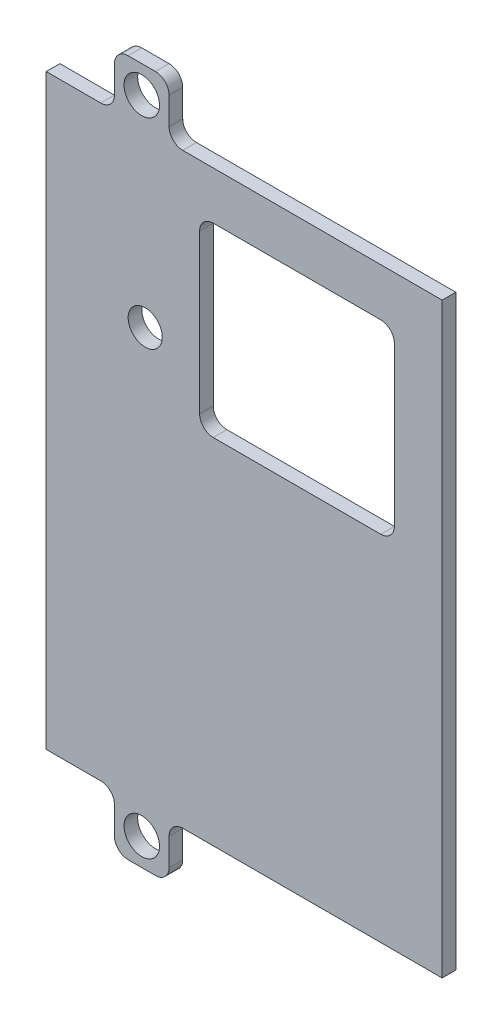
ISO-10303-21;
HEADER;
FILE_DESCRIPTION(('STEP AP214'),'2;1');
FILE_NAME('part.step','',(''),(''),'','','');
FILE_SCHEMA(('AUTOMOTIVE_DESIGN { 1 0 10303 214 1 1 1 1 }'));
ENDSEC;
DATA;
#1=APPLICATION_CONTEXT('core data for automotive mechanical design processes');
#2=APPLICATION_PROTOCOL_DEFINITION('international standard','automotive_design',2000,#1);
#3=PRODUCT_CONTEXT('',#1,'mechanical');
#4=PRODUCT('Part','Part','',(#3));
#5=PRODUCT_RELATED_PRODUCT_CATEGORY('part','',(#4));
#6=PRODUCT_DEFINITION_FORMATION('','',#4);
#7=PRODUCT_DEFINITION_CONTEXT('part definition',#1,'design');
#8=PRODUCT_DEFINITION('design','',#6,#7);
#9=PRODUCT_DEFINITION_SHAPE('','',#8);
#10=(LENGTH_UNIT() NAMED_UNIT(*) SI_UNIT(.MILLI.,.METRE.));
#11=(NAMED_UNIT(*) PLANE_ANGLE_UNIT() SI_UNIT($,.RADIAN.));
#12=(NAMED_UNIT(*) SI_UNIT($,.STERADIAN.) SOLID_ANGLE_UNIT());
#13=UNCERTAINTY_MEASURE_WITH_UNIT(LENGTH_MEASURE(1.E-05),#10,'distance_accuracy_value','');
#14=(GEOMETRIC_REPRESENTATION_CONTEXT(3) GLOBAL_UNCERTAINTY_ASSIGNED_CONTEXT((#13)) GLOBAL_UNIT_ASSIGNED_CONTEXT((#10,
#11,#12)) REPRESENTATION_CONTEXT('',''));
#15=CARTESIAN_POINT('',(0.,0.,0.));
#16=DIRECTION('',(0.,0.,1.));
#17=DIRECTION('',(1.,0.,0.));
#18=AXIS2_PLACEMENT_3D('',#15,#16,#17);
#19=CARTESIAN_POINT('',(0.,0.,0.));
#20=DIRECTION('',(0.,0.,1.));
#21=DIRECTION('',(1.,0.,0.));
#22=AXIS2_PLACEMENT_3D('',#19,#20,#21);
#23=PLANE('',#22);
#24=DIRECTION('',(1.,0.,0.));
#25=VECTOR('',#24,1.);
#26=CARTESIAN_POINT('',(0.,96.52,0.));
#27=LINE('',#26,#25);
#28=CARTESIAN_POINT('',(27.2681261110636,96.52,0.));
#29=VERTEX_POINT('',#28);
#30=CARTESIAN_POINT('',(58.42,96.52,0.));
#31=VERTEX_POINT('',#30);
#32=EDGE_CURVE('E428',#29,#31,#27,.T.);
#33=ORIENTED_EDGE('',*,*,#32,.F.);
#34=CARTESIAN_POINT('',(27.2681261110636,93.98,0.));
#35=DIRECTION('',(0.,0.,1.));
#36=DIRECTION('',(1.,0.,0.));
#37=AXIS2_PLACEMENT_3D('',#34,#35,#36);
#38=CIRCLE('',#37,2.54);
#39=CARTESIAN_POINT('',(24.7281261110636,93.98,0.));
#40=VERTEX_POINT('',#39);
#41=EDGE_CURVE('E503',#29,#40,#38,.T.);
#42=ORIENTED_EDGE('',*,*,#41,.T.);
#43=DIRECTION('',(0.,-1.,0.));
#44=VECTOR('',#43,1.);
#45=CARTESIAN_POINT('',(24.7281261110636,0.,0.));
#46=LINE('',#45,#44);
#47=CARTESIAN_POINT('',(24.7281261110636,64.5154372798244,0.));
#48=VERTEX_POINT('',#47);
#49=EDGE_CURVE('E425',#40,#48,#46,.T.);
#50=ORIENTED_EDGE('',*,*,#49,.T.);
#51=CARTESIAN_POINT('',(27.2681261110636,64.5154372798244,0.));
#52=DIRECTION('',(0.,0.,1.));
#53=DIRECTION('',(1.,0.,0.));
#54=AXIS2_PLACEMENT_3D('',#51,#52,#53);
#55=CIRCLE('',#54,2.54);
#56=CARTESIAN_POINT('',(27.2681261110636,61.9754372798244,0.));
#57=VERTEX_POINT('',#56);
#58=EDGE_CURVE('E47',#48,#57,#55,.T.);
#59=ORIENTED_EDGE('',*,*,#58,.T.);
#60=DIRECTION('',(1.,0.,0.));
#61=VECTOR('',#60,1.);
#62=CARTESIAN_POINT('',(0.,61.9754372798244,0.));
#63=LINE('',#62,#61);
#64=CARTESIAN_POINT('',(58.42,61.9754372798244,0.));
#65=VERTEX_POINT('',#64);
#66=EDGE_CURVE('E286',#57,#65,#63,.T.);
#67=ORIENTED_EDGE('',*,*,#66,.T.);
#68=CARTESIAN_POINT('',(58.42,64.5154372798244,0.));
#69=DIRECTION('',(0.,0.,1.));
#70=DIRECTION('',(1.,0.,0.));
#71=AXIS2_PLACEMENT_3D('',#68,#69,#70);
#72=CIRCLE('',#71,2.54);
#73=CARTESIAN_POINT('',(60.96,64.5154372798244,0.));
#74=VERTEX_POINT('',#73);
#75=EDGE_CURVE('E495',#65,#74,#72,.T.);
#76=ORIENTED_EDGE('',*,*,#75,.T.);
#77=DIRECTION('',(0.,-1.,0.));
#78=VECTOR('',#77,1.);
#79=CARTESIAN_POINT('',(60.96,0.,0.));
#80=LINE('',#79,#78);
#81=CARTESIAN_POINT('',(60.96,93.98,0.));
#82=VERTEX_POINT('',#81);
#83=EDGE_CURVE('E431',#82,#74,#80,.T.);
#84=ORIENTED_EDGE('',*,*,#83,.F.);
#85=CARTESIAN_POINT('',(58.42,93.98,0.));
#86=DIRECTION('',(0.,0.,1.));
#87=DIRECTION('',(1.,0.,0.));
#88=AXIS2_PLACEMENT_3D('',#85,#86,#87);
#89=CIRCLE('',#88,2.54);
#90=EDGE_CURVE('E499',#82,#31,#89,.T.);
#91=ORIENTED_EDGE('',*,*,#90,.T.);
#92=EDGE_LOOP('',(#33,#42,#50,#59,#67,#76,#84,#91));
#93=FACE_BOUND('',#92,.T.);
#94=CARTESIAN_POINT('',(13.97,110.49,0.));
#95=DIRECTION('',(0.,0.,1.));
#96=DIRECTION('',(1.,0.,0.));
#97=AXIS2_PLACEMENT_3D('',#94,#95,#96);
#98=CIRCLE('',#97,3.30199999999999);
#99=CARTESIAN_POINT('',(17.272,110.49,0.));
#100=VERTEX_POINT('',#99);
#101=EDGE_CURVE('E422',#100,#100,#98,.T.);
#102=ORIENTED_EDGE('',*,*,#101,.T.);
#103=EDGE_LOOP('',(#102));
#104=FACE_BOUND('',#103,.T.);
#105=CARTESIAN_POINT('',(13.97,-8.89,0.));
#106=DIRECTION('',(0.,0.,1.));
#107=DIRECTION('',(1.,0.,0.));
#108=AXIS2_PLACEMENT_3D('',#105,#106,#107);
#109=CIRCLE('',#108,3.302);
#110=CARTESIAN_POINT('',(17.272,-8.89,0.));
#111=VERTEX_POINT('',#110);
#112=EDGE_CURVE('E419',#111,#111,#109,.T.);
#113=ORIENTED_EDGE('',*,*,#112,.T.);
#114=EDGE_LOOP('',(#113));
#115=FACE_BOUND('',#114,.T.);
#116=CARTESIAN_POINT('',(14.6071168033948,73.3808308678719,0.));
#117=DIRECTION('',(0.,0.,1.));
#118=DIRECTION('',(1.,0.,0.));
#119=AXIS2_PLACEMENT_3D('',#116,#117,#118);
#120=CIRCLE('',#119,3.17499999998709);
#121=CARTESIAN_POINT('',(17.7821168033819,73.3808308678719,0.));
#122=VERTEX_POINT('',#121);
#123=EDGE_CURVE('E416',#122,#122,#120,.T.);
#124=ORIENTED_EDGE('',*,*,#123,.T.);
#125=EDGE_LOOP('',(#124));
#126=FACE_BOUND('',#125,.T.);
#127=DIRECTION('',(0.,1.,0.));
#128=VECTOR('',#127,1.);
#129=CARTESIAN_POINT('',(37.846,-3.80999999999999,0.));
#130=LINE('',#129,#128);
#131=CARTESIAN_POINT('',(37.846,-3.81,0.));
#132=VERTEX_POINT('',#131);
#133=CARTESIAN_POINT('',(37.846,0.,0.));
#134=VERTEX_POINT('',#133);
#135=EDGE_CURVE('E272',#132,#134,#130,.T.);
#136=ORIENTED_EDGE('',*,*,#135,.F.);
#137=DIRECTION('',(-1.,0.,0.));
#138=VECTOR('',#137,1.);
#139=CARTESIAN_POINT('',(0.,-3.81,0.));
#140=LINE('',#139,#138);
#141=CARTESIAN_POINT('',(21.59,-3.81,0.));
#142=VERTEX_POINT('',#141);
#143=EDGE_CURVE('E377',#132,#142,#140,.T.);
#144=ORIENTED_EDGE('',*,*,#143,.T.);
#145=CARTESIAN_POINT('',(21.59,-6.35,0.));
#146=DIRECTION('',(0.,0.,1.));
#147=DIRECTION('',(1.,0.,0.));
#148=AXIS2_PLACEMENT_3D('',#145,#146,#147);
#149=CIRCLE('',#148,2.54);
#150=CARTESIAN_POINT('',(19.05,-6.35,0.));
#151=VERTEX_POINT('',#150);
#152=EDGE_CURVE('E374',#142,#151,#149,.T.);
#153=ORIENTED_EDGE('',*,*,#152,.T.);
#154=DIRECTION('',(0.,-1.,0.));
#155=VECTOR('',#154,1.);
#156=CARTESIAN_POINT('',(19.05,0.,0.));
#157=LINE('',#156,#155);
#158=CARTESIAN_POINT('',(19.05,-11.43,0.));
#159=VERTEX_POINT('',#158);
#160=EDGE_CURVE('E371',#151,#159,#157,.T.);
#161=ORIENTED_EDGE('',*,*,#160,.T.);
#162=CARTESIAN_POINT('',(16.51,-11.43,0.));
#163=DIRECTION('',(0.,0.,1.));
#164=DIRECTION('',(1.,0.,0.));
#165=AXIS2_PLACEMENT_3D('',#162,#163,#164);
#166=CIRCLE('',#165,2.54);
#167=CARTESIAN_POINT('',(16.51,-13.97,0.));
#168=VERTEX_POINT('',#167);
#169=EDGE_CURVE('E368',#168,#159,#166,.T.);
#170=ORIENTED_EDGE('',*,*,#169,.F.);
#171=DIRECTION('',(-1.,0.,0.));
#172=VECTOR('',#171,1.);
#173=CARTESIAN_POINT('',(0.,-13.97,0.));
#174=LINE('',#173,#172);
#175=CARTESIAN_POINT('',(11.43,-13.97,0.));
#176=VERTEX_POINT('',#175);
#177=EDGE_CURVE('E365',#168,#176,#174,.T.);
#178=ORIENTED_EDGE('',*,*,#177,.T.);
#179=CARTESIAN_POINT('',(11.43,-11.43,0.));
#180=DIRECTION('',(0.,0.,1.));
#181=DIRECTION('',(1.,0.,0.));
#182=AXIS2_PLACEMENT_3D('',#179,#180,#181);
#183=CIRCLE('',#182,2.54);
#184=CARTESIAN_POINT('',(8.89,-11.43,0.));
#185=VERTEX_POINT('',#184);
#186=EDGE_CURVE('E362',#185,#176,#183,.T.);
#187=ORIENTED_EDGE('',*,*,#186,.F.);
#188=DIRECTION('',(0.,1.,0.));
#189=VECTOR('',#188,1.);
#190=CARTESIAN_POINT('',(8.89,0.,0.));
#191=LINE('',#190,#189);
#192=CARTESIAN_POINT('',(8.89,-6.35,0.));
#193=VERTEX_POINT('',#192);
#194=EDGE_CURVE('E276',#185,#193,#191,.T.);
#195=ORIENTED_EDGE('',*,*,#194,.T.);
#196=CARTESIAN_POINT('',(6.35,-6.35,0.));
#197=DIRECTION('',(0.,0.,1.));
#198=DIRECTION('',(1.,0.,0.));
#199=AXIS2_PLACEMENT_3D('',#196,#197,#198);
#200=CIRCLE('',#199,2.54);
#201=CARTESIAN_POINT('',(6.35,-3.81,0.));
#202=VERTEX_POINT('',#201);
#203=EDGE_CURVE('E273',#193,#202,#200,.T.);
#204=ORIENTED_EDGE('',*,*,#203,.T.);
#205=DIRECTION('',(-1.,0.,0.));
#206=VECTOR('',#205,1.);
#207=CARTESIAN_POINT('',(0.,-3.81,0.));
#208=LINE('',#207,#206);
#209=CARTESIAN_POINT('',(-3.81,-3.81,0.));
#210=VERTEX_POINT('',#209);
#211=EDGE_CURVE('E413',#202,#210,#208,.T.);
#212=ORIENTED_EDGE('',*,*,#211,.T.);
#213=DIRECTION('',(0.,1.,0.));
#214=VECTOR('',#213,1.);
#215=CARTESIAN_POINT('',(-3.81,0.,0.));
#216=LINE('',#215,#214);
#217=CARTESIAN_POINT('',(-3.80999999999998,105.41,0.));
#218=VERTEX_POINT('',#217);
#219=EDGE_CURVE('E410',#210,#218,#216,.T.);
#220=ORIENTED_EDGE('',*,*,#219,.T.);
#221=DIRECTION('',(1.,0.,0.));
#222=VECTOR('',#221,1.);
#223=CARTESIAN_POINT('',(0.,105.41,0.));
#224=LINE('',#223,#222);
#225=CARTESIAN_POINT('',(6.35,105.41,0.));
#226=VERTEX_POINT('',#225);
#227=EDGE_CURVE('E407',#218,#226,#224,.T.);
#228=ORIENTED_EDGE('',*,*,#227,.T.);
#229=CARTESIAN_POINT('',(6.35,107.95,0.));
#230=DIRECTION('',(0.,0.,1.));
#231=DIRECTION('',(1.,0.,0.));
#232=AXIS2_PLACEMENT_3D('',#229,#230,#231);
#233=CIRCLE('',#232,2.54);
#234=CARTESIAN_POINT('',(8.89,107.95,0.));
#235=VERTEX_POINT('',#234);
#236=EDGE_CURVE('E404',#226,#235,#233,.T.);
#237=ORIENTED_EDGE('',*,*,#236,.T.);
#238=DIRECTION('',(0.,1.,0.));
#239=VECTOR('',#238,1.);
#240=CARTESIAN_POINT('',(8.89,0.,0.));
#241=LINE('',#240,#239);
#242=CARTESIAN_POINT('',(8.89,113.03,0.));
#243=VERTEX_POINT('',#242);
#244=EDGE_CURVE('E401',#235,#243,#241,.T.);
#245=ORIENTED_EDGE('',*,*,#244,.T.);
#246=CARTESIAN_POINT('',(11.43,113.03,0.));
#247=DIRECTION('',(0.,0.,1.));
#248=DIRECTION('',(1.,0.,0.));
#249=AXIS2_PLACEMENT_3D('',#246,#247,#248);
#250=CIRCLE('',#249,2.54);
#251=CARTESIAN_POINT('',(11.43,115.57,0.));
#252=VERTEX_POINT('',#251);
#253=EDGE_CURVE('E398',#252,#243,#250,.T.);
#254=ORIENTED_EDGE('',*,*,#253,.F.);
#255=DIRECTION('',(1.,0.,0.));
#256=VECTOR('',#255,1.);
#257=CARTESIAN_POINT('',(0.,115.57,0.));
#258=LINE('',#257,#256);
#259=CARTESIAN_POINT('',(16.51,115.57,0.));
#260=VERTEX_POINT('',#259);
#261=EDGE_CURVE('E395',#252,#260,#258,.T.);
#262=ORIENTED_EDGE('',*,*,#261,.T.);
#263=CARTESIAN_POINT('',(16.51,113.03,0.));
#264=DIRECTION('',(0.,0.,1.));
#265=DIRECTION('',(1.,0.,0.));
#266=AXIS2_PLACEMENT_3D('',#263,#264,#265);
#267=CIRCLE('',#266,2.54);
#268=CARTESIAN_POINT('',(19.05,113.03,0.));
#269=VERTEX_POINT('',#268);
#270=EDGE_CURVE('E392',#269,#260,#267,.T.);
#271=ORIENTED_EDGE('',*,*,#270,.F.);
#272=DIRECTION('',(0.,-1.,0.));
#273=VECTOR('',#272,1.);
#274=CARTESIAN_POINT('',(19.05,0.,0.));
#275=LINE('',#274,#273);
#276=CARTESIAN_POINT('',(19.05,107.95,0.));
#277=VERTEX_POINT('',#276);
#278=EDGE_CURVE('E389',#269,#277,#275,.T.);
#279=ORIENTED_EDGE('',*,*,#278,.T.);
#280=CARTESIAN_POINT('',(21.59,107.95,0.));
#281=DIRECTION('',(0.,0.,1.));
#282=DIRECTION('',(1.,0.,0.));
#283=AXIS2_PLACEMENT_3D('',#280,#281,#282);
#284=CIRCLE('',#283,2.54);
#285=CARTESIAN_POINT('',(21.59,105.41,0.));
#286=VERTEX_POINT('',#285);
#287=EDGE_CURVE('E386',#277,#286,#284,.T.);
#288=ORIENTED_EDGE('',*,*,#287,.T.);
#289=DIRECTION('',(1.,0.,0.));
#290=VECTOR('',#289,1.);
#291=CARTESIAN_POINT('',(0.,105.41,0.));
#292=LINE('',#291,#290);
#293=CARTESIAN_POINT('',(69.85,105.41,0.));
#294=VERTEX_POINT('',#293);
#295=EDGE_CURVE('E383',#286,#294,#292,.T.);
#296=ORIENTED_EDGE('',*,*,#295,.T.);
#297=DIRECTION('',(0.,-1.,0.));
#298=VECTOR('',#297,1.);
#299=CARTESIAN_POINT('',(69.85,0.,0.));
#300=LINE('',#299,#298);
#301=CARTESIAN_POINT('',(69.85,-3.81,0.));
#302=VERTEX_POINT('',#301);
#303=EDGE_CURVE('E380',#294,#302,#300,.T.);
#304=ORIENTED_EDGE('',*,*,#303,.T.);
#305=CARTESIAN_POINT('',(46.99,-3.81,0.));
#306=VERTEX_POINT('',#305);
#307=EDGE_CURVE('E378',#302,#306,#140,.T.);
#308=ORIENTED_EDGE('',*,*,#307,.T.);
#309=DIRECTION('',(0.,-1.,0.));
#310=VECTOR('',#309,1.);
#311=CARTESIAN_POINT('',(46.99,-3.80999999999999,0.));
#312=LINE('',#311,#310);
#313=CARTESIAN_POINT('',(46.99,0.,0.));
#314=VERTEX_POINT('',#313);
#315=EDGE_CURVE('E269',#314,#306,#312,.T.);
#316=ORIENTED_EDGE('',*,*,#315,.F.);
#317=DIRECTION('',(1.,0.,0.));
#318=VECTOR('',#317,1.);
#319=CARTESIAN_POINT('',(37.846,0.,0.));
#320=LINE('',#319,#318);
#321=EDGE_CURVE('E698',#134,#314,#320,.T.);
#322=ORIENTED_EDGE('',*,*,#321,.F.);
#323=EDGE_LOOP('',(#136,#144,#153,#161,#170,#178,#187,#195,#204,#212,#220,#228,#237,#245,#254,
#262,#271,#279,#288,#296,#304,#308,#316,#322));
#324=FACE_BOUND('',#323,.T.);
#325=ADVANCED_FACE('F39',(#93,#104,#115,#126,#324),#23,.F.);
#326=CARTESIAN_POINT('',(24.7281261110636,0.,2.54));
#327=DIRECTION('',(1.,0.,0.));
#328=DIRECTION('',(0.,0.,-1.));
#329=AXIS2_PLACEMENT_3D('',#326,#327,#328);
#330=PLANE('',#329);
#331=ORIENTED_EDGE('',*,*,#49,.F.);
#332=DIRECTION('',(0.,0.,-1.));
#333=VECTOR('',#332,1.);
#334=CARTESIAN_POINT('',(24.7281261110636,93.98,2.54));
#335=LINE('',#334,#333);
#336=CARTESIAN_POINT('',(24.7281261110636,93.98,2.54));
#337=VERTEX_POINT('',#336);
#338=EDGE_CURVE('E59',#40,#337,#335,.F.);
#339=ORIENTED_EDGE('',*,*,#338,.T.);
#340=DIRECTION('',(0.,-1.,0.));
#341=VECTOR('',#340,1.);
#342=CARTESIAN_POINT('',(24.7281261110636,0.,2.54));
#343=LINE('',#342,#341);
#344=CARTESIAN_POINT('',(24.7281261110636,64.5154372798244,2.54));
#345=VERTEX_POINT('',#344);
#346=EDGE_CURVE('E348',#337,#345,#343,.T.);
#347=ORIENTED_EDGE('',*,*,#346,.T.);
#348=DIRECTION('',(0.,0.,-1.));
#349=VECTOR('',#348,1.);
#350=CARTESIAN_POINT('',(24.7281261110636,64.5154372798244,0.));
#351=LINE('',#350,#349);
#352=EDGE_CURVE('E491',#345,#48,#351,.T.);
#353=ORIENTED_EDGE('',*,*,#352,.T.);
#354=EDGE_LOOP('',(#331,#339,#347,#353));
#355=FACE_BOUND('',#354,.T.);
#356=ADVANCED_FACE('F516',(#355),#330,.T.);
#357=CARTESIAN_POINT('',(0.,96.52,2.54));
#358=DIRECTION('',(0.,1.,0.));
#359=DIRECTION('',(0.,0.,1.));
#360=AXIS2_PLACEMENT_3D('',#357,#358,#359);
#361=PLANE('',#360);
#362=ORIENTED_EDGE('',*,*,#32,.T.);
#363=DIRECTION('',(0.,0.,-1.));
#364=VECTOR('',#363,1.);
#365=CARTESIAN_POINT('',(58.42,96.52,2.54));
#366=LINE('',#365,#364);
#367=CARTESIAN_POINT('',(58.42,96.52,2.54));
#368=VERTEX_POINT('',#367);
#369=EDGE_CURVE('E489',#31,#368,#366,.F.);
#370=ORIENTED_EDGE('',*,*,#369,.T.);
#371=DIRECTION('',(1.,0.,0.));
#372=VECTOR('',#371,1.);
#373=CARTESIAN_POINT('',(0.,96.52,2.54));
#374=LINE('',#373,#372);
#375=CARTESIAN_POINT('',(27.2681261110636,96.52,2.54));
#376=VERTEX_POINT('',#375);
#377=EDGE_CURVE('E350',#376,#368,#374,.T.);
#378=ORIENTED_EDGE('',*,*,#377,.F.);
#379=DIRECTION('',(0.,0.,-1.));
#380=VECTOR('',#379,1.);
#381=CARTESIAN_POINT('',(27.2681261110636,96.52,2.54));
#382=LINE('',#381,#380);
#383=EDGE_CURVE('E486',#376,#29,#382,.T.);
#384=ORIENTED_EDGE('',*,*,#383,.T.);
#385=EDGE_LOOP('',(#362,#370,#378,#384));
#386=FACE_BOUND('',#385,.T.);
#387=ADVANCED_FACE('F524',(#386),#361,.F.);
#388=CARTESIAN_POINT('',(60.96,0.,2.54));
#389=DIRECTION('',(1.,0.,0.));
#390=DIRECTION('',(0.,0.,-1.));
#391=AXIS2_PLACEMENT_3D('',#388,#389,#390);
#392=PLANE('',#391);
#393=ORIENTED_EDGE('',*,*,#83,.T.);
#394=DIRECTION('',(0.,0.,-1.));
#395=VECTOR('',#394,1.);
#396=CARTESIAN_POINT('',(60.96,64.5154372798244,2.54));
#397=LINE('',#396,#395);
#398=CARTESIAN_POINT('',(60.96,64.5154372798244,2.54));
#399=VERTEX_POINT('',#398);
#400=EDGE_CURVE('E484',#74,#399,#397,.F.);
#401=ORIENTED_EDGE('',*,*,#400,.T.);
#402=DIRECTION('',(0.,-1.,0.));
#403=VECTOR('',#402,1.);
#404=CARTESIAN_POINT('',(60.96,0.,2.54));
#405=LINE('',#404,#403);
#406=CARTESIAN_POINT('',(60.96,93.98,2.54));
#407=VERTEX_POINT('',#406);
#408=EDGE_CURVE('E353',#407,#399,#405,.T.);
#409=ORIENTED_EDGE('',*,*,#408,.F.);
#410=DIRECTION('',(0.,0.,-1.));
#411=VECTOR('',#410,1.);
#412=CARTESIAN_POINT('',(60.96,93.98,0.));
#413=LINE('',#412,#411);
#414=EDGE_CURVE('E481',#407,#82,#413,.T.);
#415=ORIENTED_EDGE('',*,*,#414,.T.);
#416=EDGE_LOOP('',(#393,#401,#409,#415));
#417=FACE_BOUND('',#416,.T.);
#418=ADVANCED_FACE('F533',(#417),#392,.F.);
#419=CARTESIAN_POINT('',(6.35,-6.35,2.54));
#420=DIRECTION('',(0.,0.,-1.));
#421=DIRECTION('',(-1.,0.,0.));
#422=AXIS2_PLACEMENT_3D('',#419,#420,#421);
#423=CYLINDRICAL_SURFACE('',#422,2.54);
#424=ORIENTED_EDGE('',*,*,#203,.F.);
#425=DIRECTION('',(0.,0.,-1.));
#426=VECTOR('',#425,1.);
#427=CARTESIAN_POINT('',(8.89,-6.35,2.54));
#428=LINE('',#427,#426);
#429=CARTESIAN_POINT('',(8.89,-6.35,2.54));
#430=VERTEX_POINT('',#429);
#431=EDGE_CURVE('E474',#430,#193,#428,.T.);
#432=ORIENTED_EDGE('',*,*,#431,.F.);
#433=CARTESIAN_POINT('',(6.35,-6.35,2.54));
#434=DIRECTION('',(0.,0.,1.));
#435=DIRECTION('',(1.,0.,0.));
#436=AXIS2_PLACEMENT_3D('',#433,#434,#435);
#437=CIRCLE('',#436,2.54);
#438=CARTESIAN_POINT('',(6.35,-3.81,2.54));
#439=VERTEX_POINT('',#438);
#440=EDGE_CURVE('E282',#430,#439,#437,.T.);
#441=ORIENTED_EDGE('',*,*,#440,.T.);
#442=DIRECTION('',(0.,0.,-1.));
#443=VECTOR('',#442,1.);
#444=CARTESIAN_POINT('',(6.35,-3.81,2.54));
#445=LINE('',#444,#443);
#446=EDGE_CURVE('E358',#439,#202,#445,.T.);
#447=ORIENTED_EDGE('',*,*,#446,.T.);
#448=EDGE_LOOP('',(#424,#432,#441,#447));
#449=FACE_BOUND('',#448,.T.);
#450=ADVANCED_FACE('F562',(#449),#423,.F.);
#451=CARTESIAN_POINT('',(8.89,0.,2.54));
#452=DIRECTION('',(-1.,0.,0.));
#453=DIRECTION('',(0.,0.,1.));
#454=AXIS2_PLACEMENT_3D('',#451,#452,#453);
#455=PLANE('',#454);
#456=ORIENTED_EDGE('',*,*,#194,.F.);
#457=DIRECTION('',(0.,0.,-1.));
#458=VECTOR('',#457,1.);
#459=CARTESIAN_POINT('',(8.89,-11.43,2.54));
#460=LINE('',#459,#458);
#461=CARTESIAN_POINT('',(8.89,-11.43,2.54));
#462=VERTEX_POINT('',#461);
#463=EDGE_CURVE('E472',#462,#185,#460,.T.);
#464=ORIENTED_EDGE('',*,*,#463,.F.);
#465=DIRECTION('',(0.,1.,0.));
#466=VECTOR('',#465,1.);
#467=CARTESIAN_POINT('',(8.89,0.,2.54));
#468=LINE('',#467,#466);
#469=EDGE_CURVE('E285',#462,#430,#468,.T.);
#470=ORIENTED_EDGE('',*,*,#469,.T.);
#471=ORIENTED_EDGE('',*,*,#431,.T.);
#472=EDGE_LOOP('',(#456,#464,#470,#471));
#473=FACE_BOUND('',#472,.T.);
#474=ADVANCED_FACE('F647',(#473),#455,.T.);
#475=CARTESIAN_POINT('',(11.43,-11.43,2.54));
#476=DIRECTION('',(0.,0.,-1.));
#477=DIRECTION('',(-1.,0.,0.));
#478=AXIS2_PLACEMENT_3D('',#475,#476,#477);
#479=CYLINDRICAL_SURFACE('',#478,2.54);
#480=ORIENTED_EDGE('',*,*,#186,.T.);
#481=DIRECTION('',(0.,0.,-1.));
#482=VECTOR('',#481,1.);
#483=CARTESIAN_POINT('',(11.43,-13.97,2.54));
#484=LINE('',#483,#482);
#485=CARTESIAN_POINT('',(11.43,-13.97,2.54));
#486=VERTEX_POINT('',#485);
#487=EDGE_CURVE('E470',#486,#176,#484,.T.);
#488=ORIENTED_EDGE('',*,*,#487,.F.);
#489=CARTESIAN_POINT('',(11.43,-11.43,2.54));
#490=DIRECTION('',(0.,0.,1.));
#491=DIRECTION('',(1.,0.,0.));
#492=AXIS2_PLACEMENT_3D('',#489,#490,#491);
#493=CIRCLE('',#492,2.54);
#494=EDGE_CURVE('E289',#462,#486,#493,.T.);
#495=ORIENTED_EDGE('',*,*,#494,.F.);
#496=ORIENTED_EDGE('',*,*,#463,.T.);
#497=EDGE_LOOP('',(#480,#488,#495,#496));
#498=FACE_BOUND('',#497,.T.);
#499=ADVANCED_FACE('F643',(#498),#479,.T.);
#500=CARTESIAN_POINT('',(0.,-13.97,2.54));
#501=DIRECTION('',(0.,-1.,0.));
#502=DIRECTION('',(0.,0.,-1.));
#503=AXIS2_PLACEMENT_3D('',#500,#501,#502);
#504=PLANE('',#503);
#505=ORIENTED_EDGE('',*,*,#177,.F.);
#506=DIRECTION('',(0.,0.,-1.));
#507=VECTOR('',#506,1.);
#508=CARTESIAN_POINT('',(16.51,-13.97,2.54));
#509=LINE('',#508,#507);
#510=CARTESIAN_POINT('',(16.51,-13.97,2.54));
#511=VERTEX_POINT('',#510);
#512=EDGE_CURVE('E468',#511,#168,#509,.T.);
#513=ORIENTED_EDGE('',*,*,#512,.F.);
#514=DIRECTION('',(-1.,0.,0.));
#515=VECTOR('',#514,1.);
#516=CARTESIAN_POINT('',(0.,-13.97,2.54));
#517=LINE('',#516,#515);
#518=EDGE_CURVE('E291',#511,#486,#517,.T.);
#519=ORIENTED_EDGE('',*,*,#518,.T.);
#520=ORIENTED_EDGE('',*,*,#487,.T.);
#521=EDGE_LOOP('',(#505,#513,#519,#520));
#522=FACE_BOUND('',#521,.T.);
#523=ADVANCED_FACE('F639',(#522),#504,.T.);
#524=CARTESIAN_POINT('',(16.51,-11.43,2.54));
#525=DIRECTION('',(0.,0.,-1.));
#526=DIRECTION('',(-1.,0.,0.));
#527=AXIS2_PLACEMENT_3D('',#524,#525,#526);
#528=CYLINDRICAL_SURFACE('',#527,2.54);
#529=ORIENTED_EDGE('',*,*,#169,.T.);
#530=DIRECTION('',(0.,0.,-1.));
#531=VECTOR('',#530,1.);
#532=CARTESIAN_POINT('',(19.05,-11.43,2.54));
#533=LINE('',#532,#531);
#534=CARTESIAN_POINT('',(19.05,-11.43,2.54));
#535=VERTEX_POINT('',#534);
#536=EDGE_CURVE('E466',#535,#159,#533,.T.);
#537=ORIENTED_EDGE('',*,*,#536,.F.);
#538=CARTESIAN_POINT('',(16.51,-11.43,2.54));
#539=DIRECTION('',(0.,0.,1.));
#540=DIRECTION('',(1.,0.,0.));
#541=AXIS2_PLACEMENT_3D('',#538,#539,#540);
#542=CIRCLE('',#541,2.54);
#543=EDGE_CURVE('E294',#511,#535,#542,.T.);
#544=ORIENTED_EDGE('',*,*,#543,.F.);
#545=ORIENTED_EDGE('',*,*,#512,.T.);
#546=EDGE_LOOP('',(#529,#537,#544,#545));
#547=FACE_BOUND('',#546,.T.);
#548=ADVANCED_FACE('F635',(#547),#528,.T.);
#549=CARTESIAN_POINT('',(19.05,0.,2.54));
#550=DIRECTION('',(1.,0.,0.));
#551=DIRECTION('',(0.,0.,-1.));
#552=AXIS2_PLACEMENT_3D('',#549,#550,#551);
#553=PLANE('',#552);
#554=ORIENTED_EDGE('',*,*,#160,.F.);
#555=DIRECTION('',(0.,0.,-1.));
#556=VECTOR('',#555,1.);
#557=CARTESIAN_POINT('',(19.05,-6.35,2.54));
#558=LINE('',#557,#556);
#559=CARTESIAN_POINT('',(19.05,-6.35,2.54));
#560=VERTEX_POINT('',#559);
#561=EDGE_CURVE('E464',#560,#151,#558,.T.);
#562=ORIENTED_EDGE('',*,*,#561,.F.);
#563=DIRECTION('',(0.,-1.,0.));
#564=VECTOR('',#563,1.);
#565=CARTESIAN_POINT('',(19.05,0.,2.54));
#566=LINE('',#565,#564);
#567=EDGE_CURVE('E296',#560,#535,#566,.T.);
#568=ORIENTED_EDGE('',*,*,#567,.T.);
#569=ORIENTED_EDGE('',*,*,#536,.T.);
#570=EDGE_LOOP('',(#554,#562,#568,#569));
#571=FACE_BOUND('',#570,.T.);
#572=ADVANCED_FACE('F631',(#571),#553,.T.);
#573=CARTESIAN_POINT('',(21.59,-6.35,2.54));
#574=DIRECTION('',(0.,0.,-1.));
#575=DIRECTION('',(-1.,0.,0.));
#576=AXIS2_PLACEMENT_3D('',#573,#574,#575);
#577=CYLINDRICAL_SURFACE('',#576,2.54);
#578=ORIENTED_EDGE('',*,*,#152,.F.);
#579=DIRECTION('',(0.,0.,-1.));
#580=VECTOR('',#579,1.);
#581=CARTESIAN_POINT('',(21.59,-3.81,2.54));
#582=LINE('',#581,#580);
#583=CARTESIAN_POINT('',(21.59,-3.81,2.54));
#584=VERTEX_POINT('',#583);
#585=EDGE_CURVE('E461',#584,#142,#582,.T.);
#586=ORIENTED_EDGE('',*,*,#585,.F.);
#587=CARTESIAN_POINT('',(21.59,-6.35,2.54));
#588=DIRECTION('',(0.,0.,1.));
#589=DIRECTION('',(1.,0.,0.));
#590=AXIS2_PLACEMENT_3D('',#587,#588,#589);
#591=CIRCLE('',#590,2.54);
#592=EDGE_CURVE('E299',#584,#560,#591,.T.);
#593=ORIENTED_EDGE('',*,*,#592,.T.);
#594=ORIENTED_EDGE('',*,*,#561,.T.);
#595=EDGE_LOOP('',(#578,#586,#593,#594));
#596=FACE_BOUND('',#595,.T.);
#597=ADVANCED_FACE('F627',(#596),#577,.F.);
#598=CARTESIAN_POINT('',(0.,-3.81,2.54));
#599=DIRECTION('',(0.,-1.,0.));
#600=DIRECTION('',(1.,0.,0.));
#601=AXIS2_PLACEMENT_3D('',#598,#599,#600);
#602=PLANE('',#601);
#603=ORIENTED_EDGE('',*,*,#307,.F.);
#604=DIRECTION('',(0.,0.,-1.));
#605=VECTOR('',#604,1.);
#606=CARTESIAN_POINT('',(69.85,-3.81,2.54));
#607=LINE('',#606,#605);
#608=CARTESIAN_POINT('',(69.85,-3.81,2.54));
#609=VERTEX_POINT('',#608);
#610=EDGE_CURVE('E459',#609,#302,#607,.T.);
#611=ORIENTED_EDGE('',*,*,#610,.F.);
#612=DIRECTION('',(-1.,0.,0.));
#613=VECTOR('',#612,1.);
#614=CARTESIAN_POINT('',(0.,-3.81,2.54));
#615=LINE('',#614,#613);
#616=EDGE_CURVE('E302',#609,#584,#615,.T.);
#617=ORIENTED_EDGE('',*,*,#616,.T.);
#618=ORIENTED_EDGE('',*,*,#585,.T.);
#619=ORIENTED_EDGE('',*,*,#143,.F.);
#620=DIRECTION('',(0.,0.,1.));
#621=VECTOR('',#620,1.);
#622=CARTESIAN_POINT('',(37.846,-3.80999999999999,-8.89));
#623=LINE('',#622,#621);
#624=CARTESIAN_POINT('',(37.846,-3.80999999999999,-8.89));
#625=VERTEX_POINT('',#624);
#626=EDGE_CURVE('E703',#625,#132,#623,.T.);
#627=ORIENTED_EDGE('',*,*,#626,.F.);
#628=DIRECTION('',(-1.,0.,0.));
#629=VECTOR('',#628,1.);
#630=CARTESIAN_POINT('',(37.846,-3.80999999999999,-8.89));
#631=LINE('',#630,#629);
#632=CARTESIAN_POINT('',(46.99,-3.80999999999999,-8.89));
#633=VERTEX_POINT('',#632);
#634=EDGE_CURVE('E265',#633,#625,#631,.T.);
#635=ORIENTED_EDGE('',*,*,#634,.F.);
#636=DIRECTION('',(0.,0.,1.));
#637=VECTOR('',#636,1.);
#638=CARTESIAN_POINT('',(46.99,-3.80999999999999,-8.89));
#639=LINE('',#638,#637);
#640=EDGE_CURVE('E278',#633,#306,#639,.T.);
#641=ORIENTED_EDGE('',*,*,#640,.T.);
#642=EDGE_LOOP('',(#603,#611,#617,#618,#619,#627,#635,#641));
#643=FACE_BOUND('',#642,.T.);
#644=ADVANCED_FACE('F623',(#643),#602,.T.);
#645=CARTESIAN_POINT('',(69.85,0.,2.54));
#646=DIRECTION('',(1.,0.,0.));
#647=DIRECTION('',(0.,1.,0.));
#648=AXIS2_PLACEMENT_3D('',#645,#646,#647);
#649=PLANE('',#648);
#650=ORIENTED_EDGE('',*,*,#303,.F.);
#651=DIRECTION('',(0.,0.,-1.));
#652=VECTOR('',#651,1.);
#653=CARTESIAN_POINT('',(69.85,105.41,2.54));
#654=LINE('',#653,#652);
#655=CARTESIAN_POINT('',(69.85,105.41,2.54));
#656=VERTEX_POINT('',#655);
#657=EDGE_CURVE('E457',#656,#294,#654,.T.);
#658=ORIENTED_EDGE('',*,*,#657,.F.);
#659=DIRECTION('',(0.,-1.,0.));
#660=VECTOR('',#659,1.);
#661=CARTESIAN_POINT('',(69.85,0.,2.54));
#662=LINE('',#661,#660);
#663=EDGE_CURVE('E305',#656,#609,#662,.T.);
#664=ORIENTED_EDGE('',*,*,#663,.T.);
#665=ORIENTED_EDGE('',*,*,#610,.T.);
#666=EDGE_LOOP('',(#650,#658,#664,#665));
#667=FACE_BOUND('',#666,.T.);
#668=ADVANCED_FACE('F619',(#667),#649,.T.);
#669=CARTESIAN_POINT('',(0.,105.41,2.54));
#670=DIRECTION('',(0.,1.,0.));
#671=DIRECTION('',(0.,0.,1.));
#672=AXIS2_PLACEMENT_3D('',#669,#670,#671);
#673=PLANE('',#672);
#674=ORIENTED_EDGE('',*,*,#295,.F.);
#675=DIRECTION('',(0.,0.,-1.));
#676=VECTOR('',#675,1.);
#677=CARTESIAN_POINT('',(21.59,105.41,2.54));
#678=LINE('',#677,#676);
#679=CARTESIAN_POINT('',(21.59,105.41,2.54));
#680=VERTEX_POINT('',#679);
#681=EDGE_CURVE('E455',#680,#286,#678,.T.);
#682=ORIENTED_EDGE('',*,*,#681,.F.);
#683=DIRECTION('',(1.,0.,0.));
#684=VECTOR('',#683,1.);
#685=CARTESIAN_POINT('',(0.,105.41,2.54));
#686=LINE('',#685,#684);
#687=EDGE_CURVE('E308',#680,#656,#686,.T.);
#688=ORIENTED_EDGE('',*,*,#687,.T.);
#689=ORIENTED_EDGE('',*,*,#657,.T.);
#690=EDGE_LOOP('',(#674,#682,#688,#689));
#691=FACE_BOUND('',#690,.T.);
#692=ADVANCED_FACE('F615',(#691),#673,.T.);
#693=CARTESIAN_POINT('',(21.59,107.95,2.54));
#694=DIRECTION('',(0.,0.,-1.));
#695=DIRECTION('',(-1.,0.,0.));
#696=AXIS2_PLACEMENT_3D('',#693,#694,#695);
#697=CYLINDRICAL_SURFACE('',#696,2.54);
#698=ORIENTED_EDGE('',*,*,#287,.F.);
#699=DIRECTION('',(0.,0.,-1.));
#700=VECTOR('',#699,1.);
#701=CARTESIAN_POINT('',(19.05,107.95,2.54));
#702=LINE('',#701,#700);
#703=CARTESIAN_POINT('',(19.05,107.95,2.54));
#704=VERTEX_POINT('',#703);
#705=EDGE_CURVE('E453',#704,#277,#702,.T.);
#706=ORIENTED_EDGE('',*,*,#705,.F.);
#707=CARTESIAN_POINT('',(21.59,107.95,2.54));
#708=DIRECTION('',(0.,0.,1.));
#709=DIRECTION('',(1.,0.,0.));
#710=AXIS2_PLACEMENT_3D('',#707,#708,#709);
#711=CIRCLE('',#710,2.54);
#712=EDGE_CURVE('E311',#704,#680,#711,.T.);
#713=ORIENTED_EDGE('',*,*,#712,.T.);
#714=ORIENTED_EDGE('',*,*,#681,.T.);
#715=EDGE_LOOP('',(#698,#706,#713,#714));
#716=FACE_BOUND('',#715,.T.);
#717=ADVANCED_FACE('F611',(#716),#697,.F.);
#718=CARTESIAN_POINT('',(19.05,0.,2.54));
#719=DIRECTION('',(1.,0.,0.));
#720=DIRECTION('',(0.,0.,-1.));
#721=AXIS2_PLACEMENT_3D('',#718,#719,#720);
#722=PLANE('',#721);
#723=ORIENTED_EDGE('',*,*,#278,.F.);
#724=DIRECTION('',(0.,0.,-1.));
#725=VECTOR('',#724,1.);
#726=CARTESIAN_POINT('',(19.05,113.03,2.54));
#727=LINE('',#726,#725);
#728=CARTESIAN_POINT('',(19.05,113.03,2.54));
#729=VERTEX_POINT('',#728);
#730=EDGE_CURVE('E451',#729,#269,#727,.T.);
#731=ORIENTED_EDGE('',*,*,#730,.F.);
#732=DIRECTION('',(0.,-1.,0.));
#733=VECTOR('',#732,1.);
#734=CARTESIAN_POINT('',(19.05,0.,2.54));
#735=LINE('',#734,#733);
#736=EDGE_CURVE('E314',#729,#704,#735,.T.);
#737=ORIENTED_EDGE('',*,*,#736,.T.);
#738=ORIENTED_EDGE('',*,*,#705,.T.);
#739=EDGE_LOOP('',(#723,#731,#737,#738));
#740=FACE_BOUND('',#739,.T.);
#741=ADVANCED_FACE('F607',(#740),#722,.T.);
#742=CARTESIAN_POINT('',(16.51,113.03,2.54));
#743=DIRECTION('',(0.,0.,-1.));
#744=DIRECTION('',(-1.,0.,0.));
#745=AXIS2_PLACEMENT_3D('',#742,#743,#744);
#746=CYLINDRICAL_SURFACE('',#745,2.54);
#747=ORIENTED_EDGE('',*,*,#270,.T.);
#748=DIRECTION('',(0.,0.,-1.));
#749=VECTOR('',#748,1.);
#750=CARTESIAN_POINT('',(16.51,115.57,2.54));
#751=LINE('',#750,#749);
#752=CARTESIAN_POINT('',(16.51,115.57,2.54));
#753=VERTEX_POINT('',#752);
#754=EDGE_CURVE('E449',#753,#260,#751,.T.);
#755=ORIENTED_EDGE('',*,*,#754,.F.);
#756=CARTESIAN_POINT('',(16.51,113.03,2.54));
#757=DIRECTION('',(0.,0.,1.));
#758=DIRECTION('',(1.,0.,0.));
#759=AXIS2_PLACEMENT_3D('',#756,#757,#758);
#760=CIRCLE('',#759,2.54);
#761=EDGE_CURVE('E317',#729,#753,#760,.T.);
#762=ORIENTED_EDGE('',*,*,#761,.F.);
#763=ORIENTED_EDGE('',*,*,#730,.T.);
#764=EDGE_LOOP('',(#747,#755,#762,#763));
#765=FACE_BOUND('',#764,.T.);
#766=ADVANCED_FACE('F603',(#765),#746,.T.);
#767=CARTESIAN_POINT('',(0.,115.57,2.54));
#768=DIRECTION('',(0.,1.,0.));
#769=DIRECTION('',(0.,0.,1.));
#770=AXIS2_PLACEMENT_3D('',#767,#768,#769);
#771=PLANE('',#770);
#772=ORIENTED_EDGE('',*,*,#261,.F.);
#773=DIRECTION('',(0.,0.,-1.));
#774=VECTOR('',#773,1.);
#775=CARTESIAN_POINT('',(11.43,115.57,2.54));
#776=LINE('',#775,#774);
#777=CARTESIAN_POINT('',(11.43,115.57,2.54));
#778=VERTEX_POINT('',#777);
#779=EDGE_CURVE('E447',#778,#252,#776,.T.);
#780=ORIENTED_EDGE('',*,*,#779,.F.);
#781=DIRECTION('',(1.,0.,0.));
#782=VECTOR('',#781,1.);
#783=CARTESIAN_POINT('',(0.,115.57,2.54));
#784=LINE('',#783,#782);
#785=EDGE_CURVE('E319',#778,#753,#784,.T.);
#786=ORIENTED_EDGE('',*,*,#785,.T.);
#787=ORIENTED_EDGE('',*,*,#754,.T.);
#788=EDGE_LOOP('',(#772,#780,#786,#787));
#789=FACE_BOUND('',#788,.T.);
#790=ADVANCED_FACE('F599',(#789),#771,.T.);
#791=CARTESIAN_POINT('',(11.43,113.03,2.54));
#792=DIRECTION('',(0.,0.,-1.));
#793=DIRECTION('',(-1.,0.,0.));
#794=AXIS2_PLACEMENT_3D('',#791,#792,#793);
#795=CYLINDRICAL_SURFACE('',#794,2.54);
#796=ORIENTED_EDGE('',*,*,#253,.T.);
#797=DIRECTION('',(0.,0.,-1.));
#798=VECTOR('',#797,1.);
#799=CARTESIAN_POINT('',(8.89,113.03,2.54));
#800=LINE('',#799,#798);
#801=CARTESIAN_POINT('',(8.89,113.03,2.54));
#802=VERTEX_POINT('',#801);
#803=EDGE_CURVE('E445',#802,#243,#800,.T.);
#804=ORIENTED_EDGE('',*,*,#803,.F.);
#805=CARTESIAN_POINT('',(11.43,113.03,2.54));
#806=DIRECTION('',(0.,0.,1.));
#807=DIRECTION('',(1.,0.,0.));
#808=AXIS2_PLACEMENT_3D('',#805,#806,#807);
#809=CIRCLE('',#808,2.54);
#810=EDGE_CURVE('E322',#778,#802,#809,.T.);
#811=ORIENTED_EDGE('',*,*,#810,.F.);
#812=ORIENTED_EDGE('',*,*,#779,.T.);
#813=EDGE_LOOP('',(#796,#804,#811,#812));
#814=FACE_BOUND('',#813,.T.);
#815=ADVANCED_FACE('F595',(#814),#795,.T.);
#816=CARTESIAN_POINT('',(8.89,0.,2.54));
#817=DIRECTION('',(-1.,0.,0.));
#818=DIRECTION('',(0.,0.,1.));
#819=AXIS2_PLACEMENT_3D('',#816,#817,#818);
#820=PLANE('',#819);
#821=ORIENTED_EDGE('',*,*,#244,.F.);
#822=DIRECTION('',(0.,0.,-1.));
#823=VECTOR('',#822,1.);
#824=CARTESIAN_POINT('',(8.89,107.95,2.54));
#825=LINE('',#824,#823);
#826=CARTESIAN_POINT('',(8.89,107.95,2.54));
#827=VERTEX_POINT('',#826);
#828=EDGE_CURVE('E443',#827,#235,#825,.T.);
#829=ORIENTED_EDGE('',*,*,#828,.F.);
#830=DIRECTION('',(0.,1.,0.));
#831=VECTOR('',#830,1.);
#832=CARTESIAN_POINT('',(8.89,0.,2.54));
#833=LINE('',#832,#831);
#834=EDGE_CURVE('E324',#827,#802,#833,.T.);
#835=ORIENTED_EDGE('',*,*,#834,.T.);
#836=ORIENTED_EDGE('',*,*,#803,.T.);
#837=EDGE_LOOP('',(#821,#829,#835,#836));
#838=FACE_BOUND('',#837,.T.);
#839=ADVANCED_FACE('F591',(#838),#820,.T.);
#840=CARTESIAN_POINT('',(6.35,107.95,2.54));
#841=DIRECTION('',(0.,0.,-1.));
#842=DIRECTION('',(-1.,0.,0.));
#843=AXIS2_PLACEMENT_3D('',#840,#841,#842);
#844=CYLINDRICAL_SURFACE('',#843,2.54);
#845=ORIENTED_EDGE('',*,*,#236,.F.);
#846=DIRECTION('',(0.,0.,-1.));
#847=VECTOR('',#846,1.);
#848=CARTESIAN_POINT('',(6.35,105.41,2.54));
#849=LINE('',#848,#847);
#850=CARTESIAN_POINT('',(6.35,105.41,2.54));
#851=VERTEX_POINT('',#850);
#852=EDGE_CURVE('E441',#851,#226,#849,.T.);
#853=ORIENTED_EDGE('',*,*,#852,.F.);
#854=CARTESIAN_POINT('',(6.35,107.95,2.54));
#855=DIRECTION('',(0.,0.,1.));
#856=DIRECTION('',(1.,0.,0.));
#857=AXIS2_PLACEMENT_3D('',#854,#855,#856);
#858=CIRCLE('',#857,2.54);
#859=EDGE_CURVE('E327',#851,#827,#858,.T.);
#860=ORIENTED_EDGE('',*,*,#859,.T.);
#861=ORIENTED_EDGE('',*,*,#828,.T.);
#862=EDGE_LOOP('',(#845,#853,#860,#861));
#863=FACE_BOUND('',#862,.T.);
#864=ADVANCED_FACE('F587',(#863),#844,.F.);
#865=CARTESIAN_POINT('',(0.,105.41,2.54));
#866=DIRECTION('',(0.,1.,0.));
#867=DIRECTION('',(0.,0.,1.));
#868=AXIS2_PLACEMENT_3D('',#865,#866,#867);
#869=PLANE('',#868);
#870=ORIENTED_EDGE('',*,*,#227,.F.);
#871=DIRECTION('',(0.,0.,-1.));
#872=VECTOR('',#871,1.);
#873=CARTESIAN_POINT('',(-3.80999999999998,105.41,2.54));
#874=LINE('',#873,#872);
#875=CARTESIAN_POINT('',(-3.80999999999998,105.41,2.54));
#876=VERTEX_POINT('',#875);
#877=EDGE_CURVE('E439',#876,#218,#874,.T.);
#878=ORIENTED_EDGE('',*,*,#877,.F.);
#879=DIRECTION('',(1.,0.,0.));
#880=VECTOR('',#879,1.);
#881=CARTESIAN_POINT('',(0.,105.41,2.54));
#882=LINE('',#881,#880);
#883=EDGE_CURVE('E330',#876,#851,#882,.T.);
#884=ORIENTED_EDGE('',*,*,#883,.T.);
#885=ORIENTED_EDGE('',*,*,#852,.T.);
#886=EDGE_LOOP('',(#870,#878,#884,#885));
#887=FACE_BOUND('',#886,.T.);
#888=ADVANCED_FACE('F583',(#887),#869,.T.);
#889=CARTESIAN_POINT('',(-3.81,0.,2.54));
#890=DIRECTION('',(-1.,0.,0.));
#891=DIRECTION('',(0.,-1.,0.));
#892=AXIS2_PLACEMENT_3D('',#889,#890,#891);
#893=PLANE('',#892);
#894=ORIENTED_EDGE('',*,*,#219,.F.);
#895=DIRECTION('',(0.,0.,-1.));
#896=VECTOR('',#895,1.);
#897=CARTESIAN_POINT('',(-3.81,-3.81,2.54));
#898=LINE('',#897,#896);
#899=CARTESIAN_POINT('',(-3.81,-3.81,2.54));
#900=VERTEX_POINT('',#899);
#901=EDGE_CURVE('E437',#900,#210,#898,.T.);
#902=ORIENTED_EDGE('',*,*,#901,.F.);
#903=DIRECTION('',(0.,1.,0.));
#904=VECTOR('',#903,1.);
#905=CARTESIAN_POINT('',(-3.81,0.,2.54));
#906=LINE('',#905,#904);
#907=EDGE_CURVE('E333',#900,#876,#906,.T.);
#908=ORIENTED_EDGE('',*,*,#907,.T.);
#909=ORIENTED_EDGE('',*,*,#877,.T.);
#910=EDGE_LOOP('',(#894,#902,#908,#909));
#911=FACE_BOUND('',#910,.T.);
#912=ADVANCED_FACE('F569',(#911),#893,.T.);
#913=CARTESIAN_POINT('',(13.97,110.49,2.54));
#914=DIRECTION('',(0.,0.,-1.));
#915=DIRECTION('',(-1.,0.,0.));
#916=AXIS2_PLACEMENT_3D('',#913,#914,#915);
#917=CYLINDRICAL_SURFACE('',#916,3.30199999999999);
#918=CARTESIAN_POINT('',(13.97,110.49,2.54));
#919=DIRECTION('',(0.,0.,1.));
#920=DIRECTION('',(1.,0.,0.));
#921=AXIS2_PLACEMENT_3D('',#918,#919,#920);
#922=CIRCLE('',#921,3.30199999999999);
#923=CARTESIAN_POINT('',(17.272,110.49,2.54));
#924=VERTEX_POINT('',#923);
#925=EDGE_CURVE('E345',#924,#924,#922,.T.);
#926=ORIENTED_EDGE('',*,*,#925,.T.);
#927=EDGE_LOOP('',(#926));
#928=FACE_BOUND('',#927,.T.);
#929=ORIENTED_EDGE('',*,*,#101,.F.);
#930=EDGE_LOOP('',(#929));
#931=FACE_BOUND('',#930,.T.);
#932=ADVANCED_FACE('F565',(#928,#931),#917,.F.);
#933=CARTESIAN_POINT('',(13.97,-8.89,2.54));
#934=DIRECTION('',(0.,0.,-1.));
#935=DIRECTION('',(-1.,0.,0.));
#936=AXIS2_PLACEMENT_3D('',#933,#934,#935);
#937=CYLINDRICAL_SURFACE('',#936,3.302);
#938=CARTESIAN_POINT('',(13.97,-8.89,2.54));
#939=DIRECTION('',(0.,0.,1.));
#940=DIRECTION('',(1.,0.,0.));
#941=AXIS2_PLACEMENT_3D('',#938,#939,#940);
#942=CIRCLE('',#941,3.302);
#943=CARTESIAN_POINT('',(17.272,-8.89,2.54));
#944=VERTEX_POINT('',#943);
#945=EDGE_CURVE('E342',#944,#944,#942,.T.);
#946=ORIENTED_EDGE('',*,*,#945,.T.);
#947=EDGE_LOOP('',(#946));
#948=FACE_BOUND('',#947,.T.);
#949=ORIENTED_EDGE('',*,*,#112,.F.);
#950=EDGE_LOOP('',(#949));
#951=FACE_BOUND('',#950,.T.);
#952=ADVANCED_FACE('F568',(#948,#951),#937,.F.);
#953=CARTESIAN_POINT('',(14.6071168033948,73.3808308678719,2.54));
#954=DIRECTION('',(0.,0.,-1.));
#955=DIRECTION('',(-1.,0.,0.));
#956=AXIS2_PLACEMENT_3D('',#953,#954,#955);
#957=CYLINDRICAL_SURFACE('',#956,3.17499999998709);
#958=CARTESIAN_POINT('',(14.6071168033948,73.3808308678719,2.54));
#959=DIRECTION('',(0.,0.,1.));
#960=DIRECTION('',(1.,0.,0.));
#961=AXIS2_PLACEMENT_3D('',#958,#959,#960);
#962=CIRCLE('',#961,3.17499999998709);
#963=CARTESIAN_POINT('',(17.7821168033819,73.3808308678719,2.54));
#964=VERTEX_POINT('',#963);
#965=EDGE_CURVE('E339',#964,#964,#962,.T.);
#966=ORIENTED_EDGE('',*,*,#965,.T.);
#967=EDGE_LOOP('',(#966));
#968=FACE_BOUND('',#967,.T.);
#969=ORIENTED_EDGE('',*,*,#123,.F.);
#970=EDGE_LOOP('',(#969));
#971=FACE_BOUND('',#970,.T.);
#972=ADVANCED_FACE('F573',(#968,#971),#957,.F.);
#973=CARTESIAN_POINT('',(0.,-3.81,2.54));
#974=DIRECTION('',(0.,-1.,0.));
#975=DIRECTION('',(1.,0.,0.));
#976=AXIS2_PLACEMENT_3D('',#973,#974,#975);
#977=PLANE('',#976);
#978=ORIENTED_EDGE('',*,*,#211,.F.);
#979=ORIENTED_EDGE('',*,*,#446,.F.);
#980=DIRECTION('',(-1.,0.,0.));
#981=VECTOR('',#980,1.);
#982=CARTESIAN_POINT('',(0.,-3.81,2.54));
#983=LINE('',#982,#981);
#984=EDGE_CURVE('E336',#439,#900,#983,.T.);
#985=ORIENTED_EDGE('',*,*,#984,.T.);
#986=ORIENTED_EDGE('',*,*,#901,.T.);
#987=EDGE_LOOP('',(#978,#979,#985,#986));
#988=FACE_BOUND('',#987,.T.);
#989=ADVANCED_FACE('F559',(#988),#977,.T.);
#990=CARTESIAN_POINT('',(0.,61.9754372798244,2.54));
#991=DIRECTION('',(0.,1.,0.));
#992=DIRECTION('',(0.,0.,1.));
#993=AXIS2_PLACEMENT_3D('',#990,#991,#992);
#994=PLANE('',#993);
#995=DIRECTION('',(1.,0.,0.));
#996=VECTOR('',#995,1.);
#997=CARTESIAN_POINT('',(0.,61.9754372798244,2.54));
#998=LINE('',#997,#996);
#999=CARTESIAN_POINT('',(27.2681261110636,61.9754372798244,2.54));
#1000=VERTEX_POINT('',#999);
#1001=CARTESIAN_POINT('',(58.42,61.9754372798244,2.54));
#1002=VERTEX_POINT('',#1001);
#1003=EDGE_CURVE('E356',#1000,#1002,#998,.T.);
#1004=ORIENTED_EDGE('',*,*,#1003,.T.);
#1005=DIRECTION('',(0.,0.,-1.));
#1006=VECTOR('',#1005,1.);
#1007=CARTESIAN_POINT('',(58.42,61.9754372798244,2.54));
#1008=LINE('',#1007,#1006);
#1009=EDGE_CURVE('E478',#1002,#65,#1008,.T.);
#1010=ORIENTED_EDGE('',*,*,#1009,.T.);
#1011=ORIENTED_EDGE('',*,*,#66,.F.);
#1012=DIRECTION('',(0.,0.,-1.));
#1013=VECTOR('',#1012,1.);
#1014=CARTESIAN_POINT('',(27.2681261110636,61.9754372798244,2.54));
#1015=LINE('',#1014,#1013);
#1016=EDGE_CURVE('E476',#57,#1000,#1015,.F.);
#1017=ORIENTED_EDGE('',*,*,#1016,.T.);
#1018=EDGE_LOOP('',(#1004,#1010,#1011,#1017));
#1019=FACE_BOUND('',#1018,.T.);
#1020=ADVANCED_FACE('F514',(#1019),#994,.T.);
#1021=CARTESIAN_POINT('',(0.,0.,2.54));
#1022=DIRECTION('',(0.,0.,1.));
#1023=DIRECTION('',(1.,0.,0.));
#1024=AXIS2_PLACEMENT_3D('',#1021,#1022,#1023);
#1025=PLANE('',#1024);
#1026=ORIENTED_EDGE('',*,*,#440,.F.);
#1027=ORIENTED_EDGE('',*,*,#469,.F.);
#1028=ORIENTED_EDGE('',*,*,#494,.T.);
#1029=ORIENTED_EDGE('',*,*,#518,.F.);
#1030=ORIENTED_EDGE('',*,*,#543,.T.);
#1031=ORIENTED_EDGE('',*,*,#567,.F.);
#1032=ORIENTED_EDGE('',*,*,#592,.F.);
#1033=ORIENTED_EDGE('',*,*,#616,.F.);
#1034=ORIENTED_EDGE('',*,*,#663,.F.);
#1035=ORIENTED_EDGE('',*,*,#687,.F.);
#1036=ORIENTED_EDGE('',*,*,#712,.F.);
#1037=ORIENTED_EDGE('',*,*,#736,.F.);
#1038=ORIENTED_EDGE('',*,*,#761,.T.);
#1039=ORIENTED_EDGE('',*,*,#785,.F.);
#1040=ORIENTED_EDGE('',*,*,#810,.T.);
#1041=ORIENTED_EDGE('',*,*,#834,.F.);
#1042=ORIENTED_EDGE('',*,*,#859,.F.);
#1043=ORIENTED_EDGE('',*,*,#883,.F.);
#1044=ORIENTED_EDGE('',*,*,#907,.F.);
#1045=ORIENTED_EDGE('',*,*,#984,.F.);
#1046=EDGE_LOOP('',(#1026,#1027,#1028,#1029,#1030,#1031,#1032,#1033,#1034,#1035,#1036,#1037,
#1038,#1039,#1040,#1041,#1042,#1043,#1044,#1045));
#1047=FACE_BOUND('',#1046,.T.);
#1048=ORIENTED_EDGE('',*,*,#965,.F.);
#1049=EDGE_LOOP('',(#1048));
#1050=FACE_BOUND('',#1049,.T.);
#1051=ORIENTED_EDGE('',*,*,#945,.F.);
#1052=EDGE_LOOP('',(#1051));
#1053=FACE_BOUND('',#1052,.T.);
#1054=ORIENTED_EDGE('',*,*,#925,.F.);
#1055=EDGE_LOOP('',(#1054));
#1056=FACE_BOUND('',#1055,.T.);
#1057=ORIENTED_EDGE('',*,*,#346,.F.);
#1058=CARTESIAN_POINT('',(27.2681261110636,93.98,2.54));
#1059=DIRECTION('',(0.,0.,1.));
#1060=DIRECTION('',(1.,0.,0.));
#1061=AXIS2_PLACEMENT_3D('',#1058,#1059,#1060);
#1062=CIRCLE('',#1061,2.54);
#1063=EDGE_CURVE('E505',#337,#376,#1062,.F.);
#1064=ORIENTED_EDGE('',*,*,#1063,.T.);
#1065=ORIENTED_EDGE('',*,*,#377,.T.);
#1066=CARTESIAN_POINT('',(58.42,93.98,2.54));
#1067=DIRECTION('',(0.,0.,1.));
#1068=DIRECTION('',(1.,0.,0.));
#1069=AXIS2_PLACEMENT_3D('',#1066,#1067,#1068);
#1070=CIRCLE('',#1069,2.54);
#1071=EDGE_CURVE('E501',#368,#407,#1070,.F.);
#1072=ORIENTED_EDGE('',*,*,#1071,.T.);
#1073=ORIENTED_EDGE('',*,*,#408,.T.);
#1074=CARTESIAN_POINT('',(58.42,64.5154372798244,2.54));
#1075=DIRECTION('',(0.,0.,1.));
#1076=DIRECTION('',(1.,0.,0.));
#1077=AXIS2_PLACEMENT_3D('',#1074,#1075,#1076);
#1078=CIRCLE('',#1077,2.54);
#1079=EDGE_CURVE('E497',#399,#1002,#1078,.F.);
#1080=ORIENTED_EDGE('',*,*,#1079,.T.);
#1081=ORIENTED_EDGE('',*,*,#1003,.F.);
#1082=CARTESIAN_POINT('',(27.2681261110636,64.5154372798244,2.54));
#1083=DIRECTION('',(0.,0.,1.));
#1084=DIRECTION('',(1.,0.,0.));
#1085=AXIS2_PLACEMENT_3D('',#1082,#1083,#1084);
#1086=CIRCLE('',#1085,2.54);
#1087=EDGE_CURVE('E11',#1000,#345,#1086,.F.);
#1088=ORIENTED_EDGE('',*,*,#1087,.T.);
#1089=EDGE_LOOP('',(#1057,#1064,#1065,#1072,#1073,#1080,#1081,#1088));
#1090=FACE_BOUND('',#1089,.T.);
#1091=ADVANCED_FACE('F518',(#1047,#1050,#1053,#1056,#1090),#1025,.T.);
#1092=CARTESIAN_POINT('',(37.846,-3.80999999999999,-8.89));
#1093=DIRECTION('',(1.,0.,0.));
#1094=DIRECTION('',(0.,0.,-1.));
#1095=AXIS2_PLACEMENT_3D('',#1092,#1093,#1094);
#1096=PLANE('',#1095);
#1097=ORIENTED_EDGE('',*,*,#135,.T.);
#1098=DIRECTION('',(0.,0.,1.));
#1099=VECTOR('',#1098,1.);
#1100=CARTESIAN_POINT('',(37.846,0.,-8.89));
#1101=LINE('',#1100,#1099);
#1102=CARTESIAN_POINT('',(37.846,0.,-8.89));
#1103=VERTEX_POINT('',#1102);
#1104=EDGE_CURVE('E253',#1103,#134,#1101,.T.);
#1105=ORIENTED_EDGE('',*,*,#1104,.F.);
#1106=DIRECTION('',(0.,1.,0.));
#1107=VECTOR('',#1106,1.);
#1108=CARTESIAN_POINT('',(37.846,-3.80999999999999,-8.89));
#1109=LINE('',#1108,#1107);
#1110=EDGE_CURVE('E260',#625,#1103,#1109,.T.);
#1111=ORIENTED_EDGE('',*,*,#1110,.F.);
#1112=ORIENTED_EDGE('',*,*,#626,.T.);
#1113=EDGE_LOOP('',(#1097,#1105,#1111,#1112));
#1114=FACE_BOUND('',#1113,.T.);
#1115=ADVANCED_FACE('F271',(#1114),#1096,.F.);
#1116=CARTESIAN_POINT('',(37.846,0.,-8.89));
#1117=DIRECTION('',(0.,-1.,0.));
#1118=DIRECTION('',(0.,0.,-1.));
#1119=AXIS2_PLACEMENT_3D('',#1116,#1117,#1118);
#1120=PLANE('',#1119);
#1121=ORIENTED_EDGE('',*,*,#321,.T.);
#1122=DIRECTION('',(0.,0.,1.));
#1123=VECTOR('',#1122,1.);
#1124=CARTESIAN_POINT('',(46.99,0.,-8.89));
#1125=LINE('',#1124,#1123);
#1126=CARTESIAN_POINT('',(46.99,0.,-8.89));
#1127=VERTEX_POINT('',#1126);
#1128=EDGE_CURVE('E256',#1127,#314,#1125,.T.);
#1129=ORIENTED_EDGE('',*,*,#1128,.F.);
#1130=DIRECTION('',(1.,0.,0.));
#1131=VECTOR('',#1130,1.);
#1132=CARTESIAN_POINT('',(37.846,0.,-8.89));
#1133=LINE('',#1132,#1131);
#1134=EDGE_CURVE('E248',#1103,#1127,#1133,.T.);
#1135=ORIENTED_EDGE('',*,*,#1134,.F.);
#1136=ORIENTED_EDGE('',*,*,#1104,.T.);
#1137=EDGE_LOOP('',(#1121,#1129,#1135,#1136));
#1138=FACE_BOUND('',#1137,.T.);
#1139=ADVANCED_FACE('F251',(#1138),#1120,.F.);
#1140=CARTESIAN_POINT('',(46.99,-3.80999999999999,-8.89));
#1141=DIRECTION('',(-1.,0.,0.));
#1142=DIRECTION('',(0.,0.,1.));
#1143=AXIS2_PLACEMENT_3D('',#1140,#1141,#1142);
#1144=PLANE('',#1143);
#1145=ORIENTED_EDGE('',*,*,#315,.T.);
#1146=ORIENTED_EDGE('',*,*,#640,.F.);
#1147=DIRECTION('',(0.,-1.,0.));
#1148=VECTOR('',#1147,1.);
#1149=CARTESIAN_POINT('',(46.99,-3.80999999999999,-8.89));
#1150=LINE('',#1149,#1148);
#1151=EDGE_CURVE('E259',#1127,#633,#1150,.T.);
#1152=ORIENTED_EDGE('',*,*,#1151,.F.);
#1153=ORIENTED_EDGE('',*,*,#1128,.T.);
#1154=EDGE_LOOP('',(#1145,#1146,#1152,#1153));
#1155=FACE_BOUND('',#1154,.T.);
#1156=ADVANCED_FACE('F545',(#1155),#1144,.F.);
#1157=CARTESIAN_POINT('',(0.,0.,-8.89));
#1158=DIRECTION('',(0.,0.,-1.));
#1159=DIRECTION('',(-1.,0.,0.));
#1160=AXIS2_PLACEMENT_3D('',#1157,#1158,#1159);
#1161=PLANE('',#1160);
#1162=ORIENTED_EDGE('',*,*,#1110,.T.);
#1163=ORIENTED_EDGE('',*,*,#1134,.T.);
#1164=ORIENTED_EDGE('',*,*,#1151,.T.);
#1165=ORIENTED_EDGE('',*,*,#634,.T.);
#1166=EDGE_LOOP('',(#1162,#1163,#1164,#1165));
#1167=FACE_BOUND('',#1166,.T.);
#1168=ADVANCED_FACE('F263',(#1167),#1161,.T.);
#1169=CARTESIAN_POINT('',(58.42,64.5154372798244,2.54));
#1170=DIRECTION('',(0.,0.,-1.));
#1171=DIRECTION('',(-1.,0.,0.));
#1172=AXIS2_PLACEMENT_3D('',#1169,#1170,#1171);
#1173=CYLINDRICAL_SURFACE('',#1172,2.54);
#1174=ORIENTED_EDGE('',*,*,#1079,.F.);
#1175=ORIENTED_EDGE('',*,*,#400,.F.);
#1176=ORIENTED_EDGE('',*,*,#75,.F.);
#1177=ORIENTED_EDGE('',*,*,#1009,.F.);
#1178=EDGE_LOOP('',(#1174,#1175,#1176,#1177));
#1179=FACE_BOUND('',#1178,.T.);
#1180=ADVANCED_FACE('F537',(#1179),#1173,.F.);
#1181=CARTESIAN_POINT('',(58.42,93.98,2.54));
#1182=DIRECTION('',(0.,0.,1.));
#1183=DIRECTION('',(1.,0.,0.));
#1184=AXIS2_PLACEMENT_3D('',#1181,#1182,#1183);
#1185=CYLINDRICAL_SURFACE('',#1184,2.54);
#1186=ORIENTED_EDGE('',*,*,#1071,.F.);
#1187=ORIENTED_EDGE('',*,*,#369,.F.);
#1188=ORIENTED_EDGE('',*,*,#90,.F.);
#1189=ORIENTED_EDGE('',*,*,#414,.F.);
#1190=EDGE_LOOP('',(#1186,#1187,#1188,#1189));
#1191=FACE_BOUND('',#1190,.T.);
#1192=ADVANCED_FACE('F530',(#1191),#1185,.F.);
#1193=CARTESIAN_POINT('',(27.2681261110636,93.98,2.54));
#1194=DIRECTION('',(0.,0.,-1.));
#1195=DIRECTION('',(-1.,0.,0.));
#1196=AXIS2_PLACEMENT_3D('',#1193,#1194,#1195);
#1197=CYLINDRICAL_SURFACE('',#1196,2.54);
#1198=ORIENTED_EDGE('',*,*,#1063,.F.);
#1199=ORIENTED_EDGE('',*,*,#338,.F.);
#1200=ORIENTED_EDGE('',*,*,#41,.F.);
#1201=ORIENTED_EDGE('',*,*,#383,.F.);
#1202=EDGE_LOOP('',(#1198,#1199,#1200,#1201));
#1203=FACE_BOUND('',#1202,.T.);
#1204=ADVANCED_FACE('F522',(#1203),#1197,.F.);
#1205=CARTESIAN_POINT('',(27.2681261110636,64.5154372798244,2.54));
#1206=DIRECTION('',(0.,0.,1.));
#1207=DIRECTION('',(1.,0.,0.));
#1208=AXIS2_PLACEMENT_3D('',#1205,#1206,#1207);
#1209=CYLINDRICAL_SURFACE('',#1208,2.54);
#1210=ORIENTED_EDGE('',*,*,#1087,.F.);
#1211=ORIENTED_EDGE('',*,*,#1016,.F.);
#1212=ORIENTED_EDGE('',*,*,#58,.F.);
#1213=ORIENTED_EDGE('',*,*,#352,.F.);
#1214=EDGE_LOOP('',(#1210,#1211,#1212,#1213));
#1215=FACE_BOUND('',#1214,.T.);
#1216=ADVANCED_FACE('F41',(#1215),#1209,.F.);
#1217=CLOSED_SHELL('',(#325,#356,#387,#418,#450,#474,#499,#523,#548,#572,#597,#644,#668,#692,
#717,#741,#766,#790,#815,#839,#864,#888,#912,#932,#952,#972,#989,#1020,#1091,#1115,#1139,#1156,
#1168,#1180,#1192,#1204,#1216));
#1218=MANIFOLD_SOLID_BREP('B2',#1217);
#1219=ADVANCED_BREP_SHAPE_REPRESENTATION('',(#18,#1218),#14);
#1220=SHAPE_DEFINITION_REPRESENTATION(#9,#1219);
ENDSEC;
END-ISO-10303-21;
